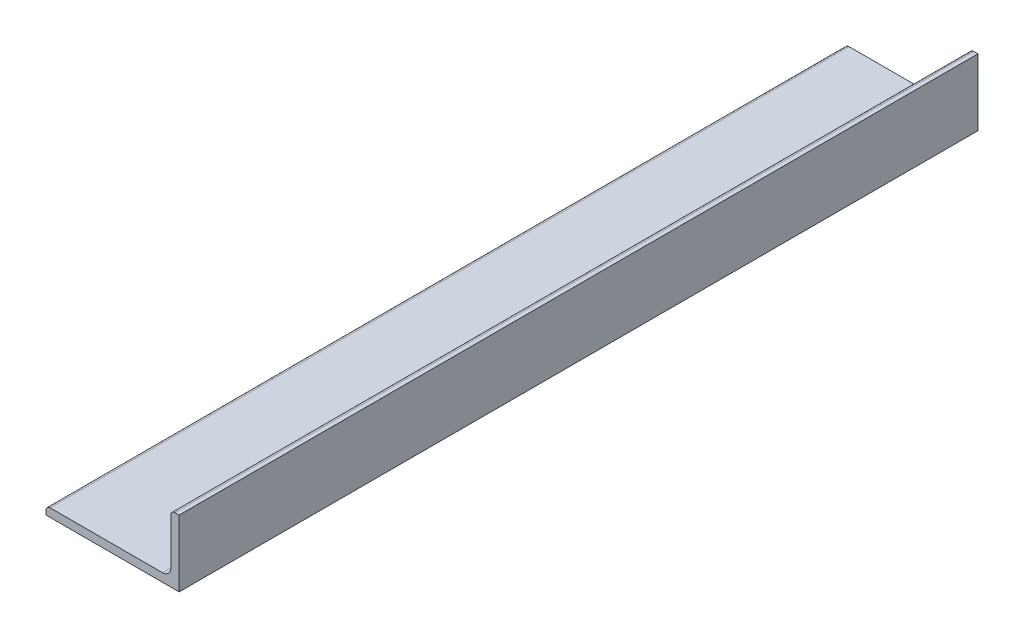
ISO-10303-21;
HEADER;
FILE_DESCRIPTION(('STEP AP214'),'2;1');
FILE_NAME('part.step','',(''),(''),'','','');
FILE_SCHEMA(('AUTOMOTIVE_DESIGN { 1 0 10303 214 1 1 1 1 }'));
ENDSEC;
DATA;
#1=APPLICATION_CONTEXT('core data for automotive mechanical design processes');
#2=APPLICATION_PROTOCOL_DEFINITION('international standard','automotive_design',2000,#1);
#3=PRODUCT_CONTEXT('',#1,'mechanical');
#4=PRODUCT('Part','Part','',(#3));
#5=PRODUCT_RELATED_PRODUCT_CATEGORY('part','',(#4));
#6=PRODUCT_DEFINITION_FORMATION('','',#4);
#7=PRODUCT_DEFINITION_CONTEXT('part definition',#1,'design');
#8=PRODUCT_DEFINITION('design','',#6,#7);
#9=PRODUCT_DEFINITION_SHAPE('','',#8);
#10=(LENGTH_UNIT() NAMED_UNIT(*) SI_UNIT(.MILLI.,.METRE.));
#11=(NAMED_UNIT(*) PLANE_ANGLE_UNIT() SI_UNIT($,.RADIAN.));
#12=(NAMED_UNIT(*) SI_UNIT($,.STERADIAN.) SOLID_ANGLE_UNIT());
#13=UNCERTAINTY_MEASURE_WITH_UNIT(LENGTH_MEASURE(1.E-05),#10,'distance_accuracy_value','');
#14=(GEOMETRIC_REPRESENTATION_CONTEXT(3) GLOBAL_UNCERTAINTY_ASSIGNED_CONTEXT((#13)) GLOBAL_UNIT_ASSIGNED_CONTEXT((#10,
#11,#12)) REPRESENTATION_CONTEXT('',''));
#15=CARTESIAN_POINT('',(0.,0.,0.));
#16=DIRECTION('',(0.,0.,1.));
#17=DIRECTION('',(1.,0.,0.));
#18=AXIS2_PLACEMENT_3D('',#15,#16,#17);
#19=CARTESIAN_POINT('',(-25.4,-11.1125,152.4));
#20=DIRECTION('',(1.,0.,0.));
#21=DIRECTION('',(0.,0.,-1.));
#22=AXIS2_PLACEMENT_3D('',#19,#20,#21);
#23=PLANE('',#22);
#24=DIRECTION('',(0.,-1.,0.));
#25=VECTOR('',#24,1.);
#26=CARTESIAN_POINT('',(-25.4,-11.1125,-152.4));
#27=LINE('',#26,#25);
#28=CARTESIAN_POINT('',(-25.4,-11.1125,-152.4));
#29=VERTEX_POINT('',#28);
#30=CARTESIAN_POINT('',(-25.4,-12.7,-152.4));
#31=VERTEX_POINT('',#30);
#32=EDGE_CURVE('E136',#29,#31,#27,.T.);
#33=ORIENTED_EDGE('',*,*,#32,.T.);
#34=DIRECTION('',(0.,0.,-1.));
#35=VECTOR('',#34,1.);
#36=CARTESIAN_POINT('',(-25.4,-12.7,152.4));
#37=LINE('',#36,#35);
#38=CARTESIAN_POINT('',(-25.4,-12.7,152.4));
#39=VERTEX_POINT('',#38);
#40=EDGE_CURVE('E11',#39,#31,#37,.T.);
#41=ORIENTED_EDGE('',*,*,#40,.F.);
#42=DIRECTION('',(0.,-1.,0.));
#43=VECTOR('',#42,1.);
#44=CARTESIAN_POINT('',(-25.4,-11.1125,152.4));
#45=LINE('',#44,#43);
#46=CARTESIAN_POINT('',(-25.4,-11.1125,152.4));
#47=VERTEX_POINT('',#46);
#48=EDGE_CURVE('E152',#47,#39,#45,.T.);
#49=ORIENTED_EDGE('',*,*,#48,.F.);
#50=DIRECTION('',(0.,0.,-1.));
#51=VECTOR('',#50,1.);
#52=CARTESIAN_POINT('',(-25.4,-11.1125,152.4));
#53=LINE('',#52,#51);
#54=EDGE_CURVE('E132',#47,#29,#53,.T.);
#55=ORIENTED_EDGE('',*,*,#54,.T.);
#56=EDGE_LOOP('',(#33,#41,#49,#55));
#57=FACE_BOUND('',#56,.T.);
#58=ADVANCED_FACE('F34',(#57),#23,.F.);
#59=CARTESIAN_POINT('',(-25.4,-12.7,152.4));
#60=DIRECTION('',(0.,1.,0.));
#61=DIRECTION('',(-1.,0.,0.));
#62=AXIS2_PLACEMENT_3D('',#59,#60,#61);
#63=PLANE('',#62);
#64=DIRECTION('',(1.,0.,0.));
#65=VECTOR('',#64,1.);
#66=CARTESIAN_POINT('',(-25.4,-12.7,-152.4));
#67=LINE('',#66,#65);
#68=CARTESIAN_POINT('',(25.4,-12.7,-152.4));
#69=VERTEX_POINT('',#68);
#70=EDGE_CURVE('E139',#31,#69,#67,.T.);
#71=ORIENTED_EDGE('',*,*,#70,.T.);
#72=DIRECTION('',(0.,0.,-1.));
#73=VECTOR('',#72,1.);
#74=CARTESIAN_POINT('',(25.4,-12.7,152.4));
#75=LINE('',#74,#73);
#76=CARTESIAN_POINT('',(25.4,-12.7,152.4));
#77=VERTEX_POINT('',#76);
#78=EDGE_CURVE('E42',#77,#69,#75,.T.);
#79=ORIENTED_EDGE('',*,*,#78,.F.);
#80=DIRECTION('',(1.,0.,0.));
#81=VECTOR('',#80,1.);
#82=CARTESIAN_POINT('',(-25.4,-12.7,152.4));
#83=LINE('',#82,#81);
#84=EDGE_CURVE('E96',#39,#77,#83,.T.);
#85=ORIENTED_EDGE('',*,*,#84,.F.);
#86=ORIENTED_EDGE('',*,*,#40,.T.);
#87=EDGE_LOOP('',(#71,#79,#85,#86));
#88=FACE_BOUND('',#87,.T.);
#89=ADVANCED_FACE('F195',(#88),#63,.F.);
#90=CARTESIAN_POINT('',(25.4,-12.7,152.4));
#91=DIRECTION('',(-1.,0.,0.));
#92=DIRECTION('',(0.,-1.,0.));
#93=AXIS2_PLACEMENT_3D('',#90,#91,#92);
#94=PLANE('',#93);
#95=DIRECTION('',(0.,1.,0.));
#96=VECTOR('',#95,1.);
#97=CARTESIAN_POINT('',(25.4,-12.7,-152.4));
#98=LINE('',#97,#96);
#99=CARTESIAN_POINT('',(25.4,12.7,-152.4));
#100=VERTEX_POINT('',#99);
#101=EDGE_CURVE('E141',#69,#100,#98,.T.);
#102=ORIENTED_EDGE('',*,*,#101,.T.);
#103=DIRECTION('',(0.,0.,-1.));
#104=VECTOR('',#103,1.);
#105=CARTESIAN_POINT('',(25.4,12.7,152.4));
#106=LINE('',#105,#104);
#107=CARTESIAN_POINT('',(25.4,12.7,152.4));
#108=VERTEX_POINT('',#107);
#109=EDGE_CURVE('E162',#108,#100,#106,.T.);
#110=ORIENTED_EDGE('',*,*,#109,.F.);
#111=DIRECTION('',(0.,1.,0.));
#112=VECTOR('',#111,1.);
#113=CARTESIAN_POINT('',(25.4,-12.7,152.4));
#114=LINE('',#113,#112);
#115=EDGE_CURVE('E170',#77,#108,#114,.T.);
#116=ORIENTED_EDGE('',*,*,#115,.F.);
#117=ORIENTED_EDGE('',*,*,#78,.T.);
#118=EDGE_LOOP('',(#102,#110,#116,#117));
#119=FACE_BOUND('',#118,.T.);
#120=ADVANCED_FACE('F168',(#119),#94,.F.);
#121=CARTESIAN_POINT('',(23.8125,12.7,152.4));
#122=DIRECTION('',(0.,-1.,0.));
#123=DIRECTION('',(0.,0.,-1.));
#124=AXIS2_PLACEMENT_3D('',#121,#122,#123);
#125=PLANE('',#124);
#126=DIRECTION('',(-1.,0.,0.));
#127=VECTOR('',#126,1.);
#128=CARTESIAN_POINT('',(23.8125,12.7,-152.4));
#129=LINE('',#128,#127);
#130=CARTESIAN_POINT('',(23.8125,12.7,-152.4));
#131=VERTEX_POINT('',#130);
#132=EDGE_CURVE('E143',#100,#131,#129,.T.);
#133=ORIENTED_EDGE('',*,*,#132,.T.);
#134=DIRECTION('',(0.,0.,-1.));
#135=VECTOR('',#134,1.);
#136=CARTESIAN_POINT('',(23.8125,12.7,152.4));
#137=LINE('',#136,#135);
#138=CARTESIAN_POINT('',(23.8125,12.7,152.4));
#139=VERTEX_POINT('',#138);
#140=EDGE_CURVE('E159',#139,#131,#137,.T.);
#141=ORIENTED_EDGE('',*,*,#140,.F.);
#142=DIRECTION('',(-1.,0.,0.));
#143=VECTOR('',#142,1.);
#144=CARTESIAN_POINT('',(23.8125,12.7,152.4));
#145=LINE('',#144,#143);
#146=EDGE_CURVE('E186',#108,#139,#145,.T.);
#147=ORIENTED_EDGE('',*,*,#146,.F.);
#148=ORIENTED_EDGE('',*,*,#109,.T.);
#149=EDGE_LOOP('',(#133,#141,#147,#148));
#150=FACE_BOUND('',#149,.T.);
#151=ADVANCED_FACE('F179',(#150),#125,.F.);
#152=CARTESIAN_POINT('',(23.8125,11.1125,152.4));
#153=DIRECTION('',(0.,0.,-1.));
#154=DIRECTION('',(-1.,0.,0.));
#155=AXIS2_PLACEMENT_3D('',#152,#153,#154);
#156=CYLINDRICAL_SURFACE('',#155,1.5875);
#157=CARTESIAN_POINT('',(23.8125,11.1125,-152.4));
#158=DIRECTION('',(0.,0.,1.));
#159=DIRECTION('',(-1.,0.,0.));
#160=AXIS2_PLACEMENT_3D('',#157,#158,#159);
#161=CIRCLE('',#160,1.5875);
#162=CARTESIAN_POINT('',(22.225,11.1125,-152.4));
#163=VERTEX_POINT('',#162);
#164=EDGE_CURVE('E145',#131,#163,#161,.T.);
#165=ORIENTED_EDGE('',*,*,#164,.T.);
#166=DIRECTION('',(0.,0.,-1.));
#167=VECTOR('',#166,1.);
#168=CARTESIAN_POINT('',(22.225,11.1125,152.4));
#169=LINE('',#168,#167);
#170=CARTESIAN_POINT('',(22.225,11.1125,152.4));
#171=VERTEX_POINT('',#170);
#172=EDGE_CURVE('E156',#171,#163,#169,.T.);
#173=ORIENTED_EDGE('',*,*,#172,.F.);
#174=CARTESIAN_POINT('',(23.8125,11.1125,152.4));
#175=DIRECTION('',(0.,0.,1.));
#176=DIRECTION('',(-1.,0.,0.));
#177=AXIS2_PLACEMENT_3D('',#174,#175,#176);
#178=CIRCLE('',#177,1.5875);
#179=EDGE_CURVE('E185',#139,#171,#178,.T.);
#180=ORIENTED_EDGE('',*,*,#179,.F.);
#181=ORIENTED_EDGE('',*,*,#140,.T.);
#182=EDGE_LOOP('',(#165,#173,#180,#181));
#183=FACE_BOUND('',#182,.T.);
#184=ADVANCED_FACE('F183',(#183),#156,.T.);
#185=CARTESIAN_POINT('',(22.225,11.1125,152.4));
#186=DIRECTION('',(1.,0.,0.));
#187=DIRECTION('',(0.,1.,0.));
#188=AXIS2_PLACEMENT_3D('',#185,#186,#187);
#189=PLANE('',#188);
#190=DIRECTION('',(0.,-1.,0.));
#191=VECTOR('',#190,1.);
#192=CARTESIAN_POINT('',(22.225,11.1125,-152.4));
#193=LINE('',#192,#191);
#194=CARTESIAN_POINT('',(22.225,-6.34999999999999,-152.4));
#195=VERTEX_POINT('',#194);
#196=EDGE_CURVE('E147',#163,#195,#193,.T.);
#197=ORIENTED_EDGE('',*,*,#196,.T.);
#198=DIRECTION('',(0.,0.,-1.));
#199=VECTOR('',#198,1.);
#200=CARTESIAN_POINT('',(22.225,-6.34999999999999,152.4));
#201=LINE('',#200,#199);
#202=CARTESIAN_POINT('',(22.225,-6.34999999999999,152.4));
#203=VERTEX_POINT('',#202);
#204=EDGE_CURVE('E127',#203,#195,#201,.T.);
#205=ORIENTED_EDGE('',*,*,#204,.F.);
#206=DIRECTION('',(0.,-1.,0.));
#207=VECTOR('',#206,1.);
#208=CARTESIAN_POINT('',(22.225,11.1125,152.4));
#209=LINE('',#208,#207);
#210=EDGE_CURVE('E118',#171,#203,#209,.T.);
#211=ORIENTED_EDGE('',*,*,#210,.F.);
#212=ORIENTED_EDGE('',*,*,#172,.T.);
#213=EDGE_LOOP('',(#197,#205,#211,#212));
#214=FACE_BOUND('',#213,.T.);
#215=ADVANCED_FACE('F207',(#214),#189,.F.);
#216=CARTESIAN_POINT('',(19.05,-6.34999999999999,152.4));
#217=DIRECTION('',(0.,0.,-1.));
#218=DIRECTION('',(-1.,0.,0.));
#219=AXIS2_PLACEMENT_3D('',#216,#217,#218);
#220=CYLINDRICAL_SURFACE('',#219,3.175);
#221=CARTESIAN_POINT('',(19.05,-6.34999999999999,-152.4));
#222=DIRECTION('',(0.,0.,-1.));
#223=DIRECTION('',(-1.,0.,0.));
#224=AXIS2_PLACEMENT_3D('',#221,#222,#223);
#225=CIRCLE('',#224,3.175);
#226=CARTESIAN_POINT('',(19.05,-9.52499999999999,-152.4));
#227=VERTEX_POINT('',#226);
#228=EDGE_CURVE('E126',#195,#227,#225,.T.);
#229=ORIENTED_EDGE('',*,*,#228,.T.);
#230=DIRECTION('',(0.,0.,-1.));
#231=VECTOR('',#230,1.);
#232=CARTESIAN_POINT('',(19.05,-9.52499999999999,152.4));
#233=LINE('',#232,#231);
#234=CARTESIAN_POINT('',(19.05,-9.52499999999999,152.4));
#235=VERTEX_POINT('',#234);
#236=EDGE_CURVE('E123',#235,#227,#233,.T.);
#237=ORIENTED_EDGE('',*,*,#236,.F.);
#238=CARTESIAN_POINT('',(19.05,-6.34999999999999,152.4));
#239=DIRECTION('',(0.,0.,-1.));
#240=DIRECTION('',(-1.,0.,0.));
#241=AXIS2_PLACEMENT_3D('',#238,#239,#240);
#242=CIRCLE('',#241,3.175);
#243=EDGE_CURVE('E112',#203,#235,#242,.T.);
#244=ORIENTED_EDGE('',*,*,#243,.F.);
#245=ORIENTED_EDGE('',*,*,#204,.T.);
#246=EDGE_LOOP('',(#229,#237,#244,#245));
#247=FACE_BOUND('',#246,.T.);
#248=ADVANCED_FACE('F124',(#247),#220,.F.);
#249=CARTESIAN_POINT('',(19.05,-9.52499999999999,152.4));
#250=DIRECTION('',(0.,-1.,0.));
#251=DIRECTION('',(1.,0.,0.));
#252=AXIS2_PLACEMENT_3D('',#249,#250,#251);
#253=PLANE('',#252);
#254=DIRECTION('',(-1.,0.,0.));
#255=VECTOR('',#254,1.);
#256=CARTESIAN_POINT('',(19.05,-9.52499999999999,-152.4));
#257=LINE('',#256,#255);
#258=CARTESIAN_POINT('',(-23.8125,-9.525,-152.4));
#259=VERTEX_POINT('',#258);
#260=EDGE_CURVE('E82',#227,#259,#257,.T.);
#261=ORIENTED_EDGE('',*,*,#260,.T.);
#262=DIRECTION('',(0.,0.,-1.));
#263=VECTOR('',#262,1.);
#264=CARTESIAN_POINT('',(-23.8125,-9.525,152.4));
#265=LINE('',#264,#263);
#266=CARTESIAN_POINT('',(-23.8125,-9.525,152.4));
#267=VERTEX_POINT('',#266);
#268=EDGE_CURVE('E128',#267,#259,#265,.T.);
#269=ORIENTED_EDGE('',*,*,#268,.F.);
#270=DIRECTION('',(-1.,0.,0.));
#271=VECTOR('',#270,1.);
#272=CARTESIAN_POINT('',(19.05,-9.52499999999999,152.4));
#273=LINE('',#272,#271);
#274=EDGE_CURVE('E116',#235,#267,#273,.T.);
#275=ORIENTED_EDGE('',*,*,#274,.F.);
#276=ORIENTED_EDGE('',*,*,#236,.T.);
#277=EDGE_LOOP('',(#261,#269,#275,#276));
#278=FACE_BOUND('',#277,.T.);
#279=ADVANCED_FACE('F130',(#278),#253,.F.);
#280=CARTESIAN_POINT('',(-23.8125,-11.1125,152.4));
#281=DIRECTION('',(0.,0.,-1.));
#282=DIRECTION('',(-1.,0.,0.));
#283=AXIS2_PLACEMENT_3D('',#280,#281,#282);
#284=CYLINDRICAL_SURFACE('',#283,1.5875);
#285=CARTESIAN_POINT('',(-23.8125,-11.1125,-152.4));
#286=DIRECTION('',(0.,0.,1.));
#287=DIRECTION('',(-1.,0.,0.));
#288=AXIS2_PLACEMENT_3D('',#285,#286,#287);
#289=CIRCLE('',#288,1.5875);
#290=EDGE_CURVE('E88',#259,#29,#289,.T.);
#291=ORIENTED_EDGE('',*,*,#290,.T.);
#292=ORIENTED_EDGE('',*,*,#54,.F.);
#293=CARTESIAN_POINT('',(-23.8125,-11.1125,152.4));
#294=DIRECTION('',(0.,0.,1.));
#295=DIRECTION('',(-1.,0.,0.));
#296=AXIS2_PLACEMENT_3D('',#293,#294,#295);
#297=CIRCLE('',#296,1.5875);
#298=EDGE_CURVE('E50',#267,#47,#297,.T.);
#299=ORIENTED_EDGE('',*,*,#298,.F.);
#300=ORIENTED_EDGE('',*,*,#268,.T.);
#301=EDGE_LOOP('',(#291,#292,#299,#300));
#302=FACE_BOUND('',#301,.T.);
#303=ADVANCED_FACE('F215',(#302),#284,.T.);
#304=CARTESIAN_POINT('',(23.8125,11.1125,152.4));
#305=DIRECTION('',(0.,0.,-1.));
#306=DIRECTION('',(-1.,0.,0.));
#307=AXIS2_PLACEMENT_3D('',#304,#305,#306);
#308=PLANE('',#307);
#309=ORIENTED_EDGE('',*,*,#48,.T.);
#310=ORIENTED_EDGE('',*,*,#84,.T.);
#311=ORIENTED_EDGE('',*,*,#115,.T.);
#312=ORIENTED_EDGE('',*,*,#146,.T.);
#313=ORIENTED_EDGE('',*,*,#179,.T.);
#314=ORIENTED_EDGE('',*,*,#210,.T.);
#315=ORIENTED_EDGE('',*,*,#243,.T.);
#316=ORIENTED_EDGE('',*,*,#274,.T.);
#317=ORIENTED_EDGE('',*,*,#298,.T.);
#318=EDGE_LOOP('',(#309,#310,#311,#312,#313,#314,#315,#316,#317));
#319=FACE_BOUND('',#318,.T.);
#320=ADVANCED_FACE('F114',(#319),#308,.F.);
#321=CARTESIAN_POINT('',(23.8125,11.1125,-152.4));
#322=DIRECTION('',(0.,0.,-1.));
#323=DIRECTION('',(-1.,0.,0.));
#324=AXIS2_PLACEMENT_3D('',#321,#322,#323);
#325=PLANE('',#324);
#326=ORIENTED_EDGE('',*,*,#32,.F.);
#327=ORIENTED_EDGE('',*,*,#290,.F.);
#328=ORIENTED_EDGE('',*,*,#260,.F.);
#329=ORIENTED_EDGE('',*,*,#228,.F.);
#330=ORIENTED_EDGE('',*,*,#196,.F.);
#331=ORIENTED_EDGE('',*,*,#164,.F.);
#332=ORIENTED_EDGE('',*,*,#132,.F.);
#333=ORIENTED_EDGE('',*,*,#101,.F.);
#334=ORIENTED_EDGE('',*,*,#70,.F.);
#335=EDGE_LOOP('',(#326,#327,#328,#329,#330,#331,#332,#333,#334));
#336=FACE_BOUND('',#335,.T.);
#337=ADVANCED_FACE('F174',(#336),#325,.T.);
#338=CLOSED_SHELL('',(#58,#89,#120,#151,#184,#215,#248,#279,#303,#320,#337));
#339=MANIFOLD_SOLID_BREP('B2',#338);
#340=ADVANCED_BREP_SHAPE_REPRESENTATION('',(#18,#339),#14);
#341=SHAPE_DEFINITION_REPRESENTATION(#9,#340);
ENDSEC;
END-ISO-10303-21;
